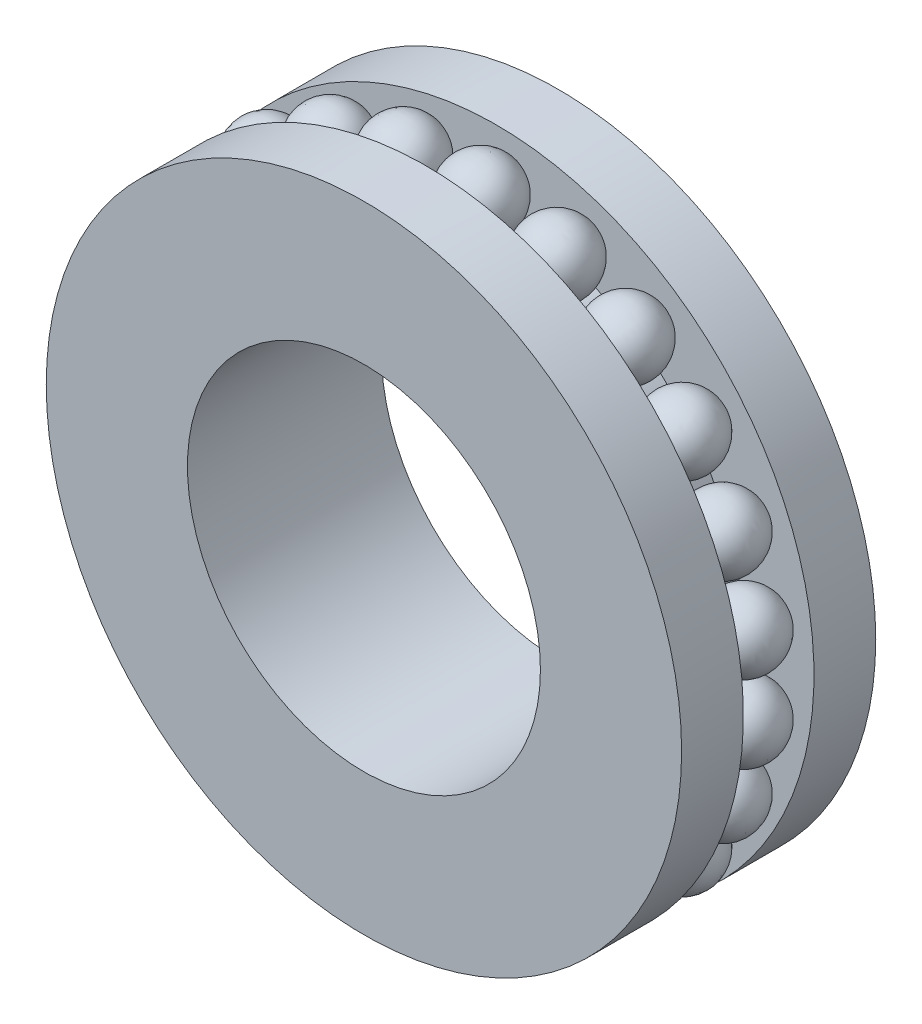
ISO-10303-21;
HEADER;
FILE_DESCRIPTION(('STEP AP214'),'2;1');
FILE_NAME('part.step','',(''),(''),'','','');
FILE_SCHEMA(('AUTOMOTIVE_DESIGN { 1 0 10303 214 1 1 1 1 }'));
ENDSEC;
DATA;
#1=APPLICATION_CONTEXT('core data for automotive mechanical design processes');
#2=APPLICATION_PROTOCOL_DEFINITION('international standard','automotive_design',2000,#1);
#3=PRODUCT_CONTEXT('',#1,'mechanical');
#4=PRODUCT('Part','Part','',(#3));
#5=PRODUCT_RELATED_PRODUCT_CATEGORY('part','',(#4));
#6=PRODUCT_DEFINITION_FORMATION('','',#4);
#7=PRODUCT_DEFINITION_CONTEXT('part definition',#1,'design');
#8=PRODUCT_DEFINITION('design','',#6,#7);
#9=PRODUCT_DEFINITION_SHAPE('','',#8);
#10=(LENGTH_UNIT() NAMED_UNIT(*) SI_UNIT(.MILLI.,.METRE.));
#11=(NAMED_UNIT(*) PLANE_ANGLE_UNIT() SI_UNIT($,.RADIAN.));
#12=(NAMED_UNIT(*) SI_UNIT($,.STERADIAN.) SOLID_ANGLE_UNIT());
#13=UNCERTAINTY_MEASURE_WITH_UNIT(LENGTH_MEASURE(1.E-05),#10,'distance_accuracy_value','');
#14=(GEOMETRIC_REPRESENTATION_CONTEXT(3) GLOBAL_UNCERTAINTY_ASSIGNED_CONTEXT((#13)) GLOBAL_UNIT_ASSIGNED_CONTEXT((#10,
#11,#12)) REPRESENTATION_CONTEXT('',''));
#15=CARTESIAN_POINT('',(0.,0.,0.));
#16=DIRECTION('',(0.,0.,1.));
#17=DIRECTION('',(1.,0.,0.));
#18=AXIS2_PLACEMENT_3D('',#15,#16,#17);
#19=CARTESIAN_POINT('',(-7.77421702330407,-2.1782334565188,2.75));
#20=DIRECTION('',(0.,0.,1.));
#21=DIRECTION('',(-0.962917287347803,-0.269796771157012,0.));
#22=AXIS2_PLACEMENT_3D('',#19,#20,#21);
#23=SPHERICAL_SURFACE('',#22,1.);
#24=CARTESIAN_POINT('',(-7.77421702330407,-2.1782334565188,3.75));
#25=VERTEX_POINT('',#24);
#26=VERTEX_LOOP('',#25);
#27=FACE_BOUND('',#26,.T.);
#28=ADVANCED_FACE('F42',(#27),#23,.T.);
#29=CLOSED_SHELL('',(#28));
#30=MANIFOLD_SOLID_BREP('B2',#29);
#31=CARTESIAN_POINT('',(-6.89824761393806,-4.19491730232272,2.75));
#32=DIRECTION('',(0.,0.,1.));
#33=DIRECTION('',(-0.854419404546495,-0.519583950035423,0.));
#34=AXIS2_PLACEMENT_3D('',#31,#32,#33);
#35=SPHERICAL_SURFACE('',#34,1.);
#36=CARTESIAN_POINT('',(-6.89824761393806,-4.19491730232272,3.75));
#37=VERTEX_POINT('',#36);
#38=VERTEX_LOOP('',#37);
#39=FACE_BOUND('',#38,.T.);
#40=ADVANCED_FACE('F61',(#39),#35,.T.);
#41=CLOSED_SHELL('',(#40));
#42=MANIFOLD_SOLID_BREP('B6',#41);
#43=CARTESIAN_POINT('',(-5.51066673642925,-5.90048332228308,2.75));
#44=DIRECTION('',(0.,0.,1.));
#45=DIRECTION('',(-0.682553143218663,-0.730835964278116,0.));
#46=AXIS2_PLACEMENT_3D('',#43,#44,#45);
#47=SPHERICAL_SURFACE('',#46,1.);
#48=CARTESIAN_POINT('',(-5.51066673642925,-5.90048332228308,3.75));
#49=VERTEX_POINT('',#48);
#50=VERTEX_LOOP('',#49);
#51=FACE_BOUND('',#50,.T.);
#52=ADVANCED_FACE('F80',(#51),#47,.T.);
#53=CLOSED_SHELL('',(#52));
#54=MANIFOLD_SOLID_BREP('B38',#53);
#55=CARTESIAN_POINT('',(-3.71438491670236,-7.16843748714479,2.75));
#56=DIRECTION('',(0.,0.,1.));
#57=DIRECTION('',(-0.460065037731162,-0.88788521840237,0.));
#58=AXIS2_PLACEMENT_3D('',#55,#56,#57);
#59=SPHERICAL_SURFACE('',#58,1.);
#60=CARTESIAN_POINT('',(-3.71438491670236,-7.16843748714479,3.75));
#61=VERTEX_POINT('',#60);
#62=VERTEX_LOOP('',#61);
#63=FACE_BOUND('',#62,.T.);
#64=ADVANCED_FACE('F99',(#63),#59,.T.);
#65=CLOSED_SHELL('',(#64));
#66=MANIFOLD_SOLID_BREP('B57',#65);
#67=CARTESIAN_POINT('',(-1.64262415988398,-7.90474143700438,2.75));
#68=DIRECTION('',(0.,0.,1.));
#69=DIRECTION('',(-0.203456013052645,-0.979084087682321,0.));
#70=AXIS2_PLACEMENT_3D('',#67,#68,#69);
#71=SPHERICAL_SURFACE('',#70,1.);
#72=CARTESIAN_POINT('',(-1.64262415988398,-7.90474143700438,3.75));
#73=VERTEX_POINT('',#72);
#74=VERTEX_LOOP('',#73);
#75=FACE_BOUND('',#74,.T.);
#76=ADVANCED_FACE('F118',(#75),#71,.T.);
#77=CLOSED_SHELL('',(#76));
#78=MANIFOLD_SOLID_BREP('B76',#77);
#79=CARTESIAN_POINT('',(0.550962516367486,-8.05478687626722,2.75));
#80=DIRECTION('',(0.,0.,1.));
#81=DIRECTION('',(0.0682424133646607,-0.99766876919054,0.));
#82=AXIS2_PLACEMENT_3D('',#79,#80,#81);
#83=SPHERICAL_SURFACE('',#82,1.);
#84=CARTESIAN_POINT('',(0.550962516367486,-8.05478687626722,3.75));
#85=VERTEX_POINT('',#84);
#86=VERTEX_LOOP('',#85);
#87=FACE_BOUND('',#86,.T.);
#88=ADVANCED_FACE('F137',(#87),#83,.T.);
#89=CLOSED_SHELL('',(#88));
#90=MANIFOLD_SOLID_BREP('B95',#89);
#91=CARTESIAN_POINT('',(2.70368682326577,-7.60744562111539,2.75));
#92=DIRECTION('',(0.,0.,1.));
#93=DIRECTION('',(0.334879612170977,-0.942260922118824,0.));
#94=AXIS2_PLACEMENT_3D('',#91,#92,#93);
#95=SPHERICAL_SURFACE('',#94,1.);
#96=CARTESIAN_POINT('',(2.70368682326577,-7.60744562111539,3.75));
#97=VERTEX_POINT('',#96);
#98=VERTEX_LOOP('',#97);
#99=FACE_BOUND('',#98,.T.);
#100=ADVANCED_FACE('F156',(#99),#95,.T.);
#101=CLOSED_SHELL('',(#100));
#102=MANIFOLD_SOLID_BREP('B114',#101);
#103=CARTESIAN_POINT('',(4.65589104702665,-6.59589492599342,2.75));
#104=DIRECTION('',(0.,0.,1.));
#105=DIRECTION('',(0.57668032211486,-0.816969893010447,0.));
#106=AXIS2_PLACEMENT_3D('',#103,#104,#105);
#107=SPHERICAL_SURFACE('',#106,1.);
#108=CARTESIAN_POINT('',(4.65589104702665,-6.59589492599342,3.75));
#109=VERTEX_POINT('',#108);
#110=VERTEX_LOOP('',#109);
#111=FACE_BOUND('',#110,.T.);
#112=ADVANCED_FACE('F175',(#111),#107,.T.);
#113=CLOSED_SHELL('',(#112));
#114=MANIFOLD_SOLID_BREP('B133',#113);
#115=CARTESIAN_POINT('',(6.26278913111383,-5.09515687842201,2.75));
#116=DIRECTION('',(0.,0.,1.));
#117=DIRECTION('',(0.775711290704414,-0.631087944326059,0.));
#118=AXIS2_PLACEMENT_3D('',#115,#116,#117);
#119=SPHERICAL_SURFACE('',#118,1.);
#120=CARTESIAN_POINT('',(6.26278913111383,-5.09515687842201,3.75));
#121=VERTEX_POINT('',#120);
#122=VERTEX_LOOP('',#121);
#123=FACE_BOUND('',#122,.T.);
#124=ADVANCED_FACE('F194',(#123),#119,.T.);
#125=CLOSED_SHELL('',(#124));
#126=MANIFOLD_SOLID_BREP('B152',#125);
#127=CARTESIAN_POINT('',(7.40520479570018,-3.21653435396978,2.75));
#128=DIRECTION('',(0.,0.,1.));
#129=DIRECTION('',(0.91721130150545,-0.398401089846249,0.));
#130=AXIS2_PLACEMENT_3D('',#127,#128,#129);
#131=SPHERICAL_SURFACE('',#130,1.);
#132=CARTESIAN_POINT('',(7.40520479570018,-3.21653435396978,3.75));
#133=VERTEX_POINT('',#132);
#134=VERTEX_LOOP('',#133);
#135=FACE_BOUND('',#134,.T.);
#136=ADVANCED_FACE('F213',(#135),#131,.T.);
#137=CLOSED_SHELL('',(#136));
#138=MANIFOLD_SOLID_BREP('B171',#137);
#139=CARTESIAN_POINT('',(7.99841029714722,-1.09935619114917,2.75));
#140=DIRECTION('',(0.,0.,1.));
#141=DIRECTION('',(0.99068594603633,-0.136166649096254,0.));
#142=AXIS2_PLACEMENT_3D('',#139,#140,#141);
#143=SPHERICAL_SURFACE('',#142,1.);
#144=CARTESIAN_POINT('',(7.99841029714722,-1.09935619114917,3.75));
#145=VERTEX_POINT('',#144);
#146=VERTEX_LOOP('',#145);
#147=FACE_BOUND('',#146,.T.);
#148=ADVANCED_FACE('F232',(#147),#143,.T.);
#149=CLOSED_SHELL('',(#148));
#150=MANIFOLD_SOLID_BREP('B190',#149);
#151=CARTESIAN_POINT('',(7.99841029714723,1.09935619114906,2.75));
#152=DIRECTION('',(0.,0.,1.));
#153=DIRECTION('',(0.990685946036332,0.13616664909624,0.));
#154=AXIS2_PLACEMENT_3D('',#151,#152,#153);
#155=SPHERICAL_SURFACE('',#154,1.);
#156=CARTESIAN_POINT('',(7.99841029714723,1.09935619114906,3.75));
#157=VERTEX_POINT('',#156);
#158=VERTEX_LOOP('',#157);
#159=FACE_BOUND('',#158,.T.);
#160=ADVANCED_FACE('F251',(#159),#155,.T.);
#161=CLOSED_SHELL('',(#160));
#162=MANIFOLD_SOLID_BREP('B209',#161);
#163=CARTESIAN_POINT('',(7.40520479570022,3.21653435396968,2.75));
#164=DIRECTION('',(0.,0.,1.));
#165=DIRECTION('',(0.917211301505455,0.398401089846236,0.));
#166=AXIS2_PLACEMENT_3D('',#163,#164,#165);
#167=SPHERICAL_SURFACE('',#166,1.);
#168=CARTESIAN_POINT('',(7.40520479570022,3.21653435396968,3.75));
#169=VERTEX_POINT('',#168);
#170=VERTEX_LOOP('',#169);
#171=FACE_BOUND('',#170,.T.);
#172=ADVANCED_FACE('F270',(#171),#167,.T.);
#173=CLOSED_SHELL('',(#172));
#174=MANIFOLD_SOLID_BREP('B228',#173);
#175=CARTESIAN_POINT('',(6.2627891311139,5.09515687842192,2.75));
#176=DIRECTION('',(0.,0.,1.));
#177=DIRECTION('',(0.775711290704423,0.631087944326049,0.));
#178=AXIS2_PLACEMENT_3D('',#175,#176,#177);
#179=SPHERICAL_SURFACE('',#178,1.);
#180=CARTESIAN_POINT('',(6.2627891311139,5.09515687842192,3.75));
#181=VERTEX_POINT('',#180);
#182=VERTEX_LOOP('',#181);
#183=FACE_BOUND('',#182,.T.);
#184=ADVANCED_FACE('F289',(#183),#179,.T.);
#185=CLOSED_SHELL('',(#184));
#186=MANIFOLD_SOLID_BREP('B247',#185);
#187=CARTESIAN_POINT('',(4.65589104702674,6.59589492599336,2.75));
#188=DIRECTION('',(0.,0.,1.));
#189=DIRECTION('',(0.576680322114871,0.816969893010439,0.));
#190=AXIS2_PLACEMENT_3D('',#187,#188,#189);
#191=SPHERICAL_SURFACE('',#190,1.);
#192=CARTESIAN_POINT('',(4.65589104702674,6.59589492599336,3.75));
#193=VERTEX_POINT('',#192);
#194=VERTEX_LOOP('',#193);
#195=FACE_BOUND('',#194,.T.);
#196=ADVANCED_FACE('F308',(#195),#191,.T.);
#197=CLOSED_SHELL('',(#196));
#198=MANIFOLD_SOLID_BREP('B266',#197);
#199=CARTESIAN_POINT('',(2.70368682326588,7.60744562111535,2.75));
#200=DIRECTION('',(0.,0.,1.));
#201=DIRECTION('',(0.33487961217099,0.942260922118819,0.));
#202=AXIS2_PLACEMENT_3D('',#199,#200,#201);
#203=SPHERICAL_SURFACE('',#202,1.);
#204=CARTESIAN_POINT('',(2.70368682326588,7.60744562111535,3.75));
#205=VERTEX_POINT('',#204);
#206=VERTEX_LOOP('',#205);
#207=FACE_BOUND('',#206,.T.);
#208=ADVANCED_FACE('F327',(#207),#203,.T.);
#209=CLOSED_SHELL('',(#208));
#210=MANIFOLD_SOLID_BREP('B285',#209);
#211=CARTESIAN_POINT('',(0.550962516367598,8.05478687626722,2.75));
#212=DIRECTION('',(0.,0.,1.));
#213=DIRECTION('',(0.0682424133646747,0.997668769190539,0.));
#214=AXIS2_PLACEMENT_3D('',#211,#212,#213);
#215=SPHERICAL_SURFACE('',#214,1.);
#216=CARTESIAN_POINT('',(0.550962516367598,8.05478687626722,3.75));
#217=VERTEX_POINT('',#216);
#218=VERTEX_LOOP('',#217);
#219=FACE_BOUND('',#218,.T.);
#220=ADVANCED_FACE('F346',(#219),#215,.T.);
#221=CLOSED_SHELL('',(#220));
#222=MANIFOLD_SOLID_BREP('B304',#221);
#223=CARTESIAN_POINT('',(-1.64262415988387,7.90474143700441,2.75));
#224=DIRECTION('',(0.,0.,1.));
#225=DIRECTION('',(-0.203456013052631,0.979084087682323,0.));
#226=AXIS2_PLACEMENT_3D('',#223,#224,#225);
#227=SPHERICAL_SURFACE('',#226,1.);
#228=CARTESIAN_POINT('',(-1.64262415988387,7.90474143700441,3.75));
#229=VERTEX_POINT('',#228);
#230=VERTEX_LOOP('',#229);
#231=FACE_BOUND('',#230,.T.);
#232=ADVANCED_FACE('F365',(#231),#227,.T.);
#233=CLOSED_SHELL('',(#232));
#234=MANIFOLD_SOLID_BREP('B323',#233);
#235=CARTESIAN_POINT('',(-3.71438491670226,7.16843748714484,2.75));
#236=DIRECTION('',(0.,0.,1.));
#237=DIRECTION('',(-0.46006503773115,0.887885218402376,0.));
#238=AXIS2_PLACEMENT_3D('',#235,#236,#237);
#239=SPHERICAL_SURFACE('',#238,1.);
#240=CARTESIAN_POINT('',(-3.71438491670226,7.16843748714484,3.75));
#241=VERTEX_POINT('',#240);
#242=VERTEX_LOOP('',#241);
#243=FACE_BOUND('',#242,.T.);
#244=ADVANCED_FACE('F384',(#243),#239,.T.);
#245=CLOSED_SHELL('',(#244));
#246=MANIFOLD_SOLID_BREP('B342',#245);
#247=CARTESIAN_POINT('',(-5.51066673642918,5.90048332228316,2.75));
#248=DIRECTION('',(0.,0.,1.));
#249=DIRECTION('',(-0.682553143218653,0.730835964278125,0.));
#250=AXIS2_PLACEMENT_3D('',#247,#248,#249);
#251=SPHERICAL_SURFACE('',#250,1.);
#252=CARTESIAN_POINT('',(-5.51066673642918,5.90048332228316,3.75));
#253=VERTEX_POINT('',#252);
#254=VERTEX_LOOP('',#253);
#255=FACE_BOUND('',#254,.T.);
#256=ADVANCED_FACE('F403',(#255),#251,.T.);
#257=CLOSED_SHELL('',(#256));
#258=MANIFOLD_SOLID_BREP('B361',#257);
#259=CARTESIAN_POINT('',(-6.898247613938,4.19491730232282,2.75));
#260=DIRECTION('',(0.,0.,1.));
#261=DIRECTION('',(-0.854419404546488,0.519583950035435,0.));
#262=AXIS2_PLACEMENT_3D('',#259,#260,#261);
#263=SPHERICAL_SURFACE('',#262,1.);
#264=CARTESIAN_POINT('',(-6.898247613938,4.19491730232282,3.75));
#265=VERTEX_POINT('',#264);
#266=VERTEX_LOOP('',#265);
#267=FACE_BOUND('',#266,.T.);
#268=ADVANCED_FACE('F422',(#267),#263,.T.);
#269=CLOSED_SHELL('',(#268));
#270=MANIFOLD_SOLID_BREP('B380',#269);
#271=CARTESIAN_POINT('',(-7.77421702330404,2.17823345651891,2.75));
#272=DIRECTION('',(0.,0.,1.));
#273=DIRECTION('',(-0.962917287347799,0.269796771157025,0.));
#274=AXIS2_PLACEMENT_3D('',#271,#272,#273);
#275=SPHERICAL_SURFACE('',#274,1.);
#276=CARTESIAN_POINT('',(-7.77421702330404,2.17823345651891,3.75));
#277=VERTEX_POINT('',#276);
#278=VERTEX_LOOP('',#277);
#279=FACE_BOUND('',#278,.T.);
#280=ADVANCED_FACE('F441',(#279),#275,.T.);
#281=CLOSED_SHELL('',(#280));
#282=MANIFOLD_SOLID_BREP('B399',#281);
#283=CARTESIAN_POINT('',(-8.07360832072802,0.,2.75));
#284=DIRECTION('',(0.,0.,1.));
#285=DIRECTION('',(-1.,0.,0.));
#286=AXIS2_PLACEMENT_3D('',#283,#284,#285);
#287=SPHERICAL_SURFACE('',#286,1.);
#288=CARTESIAN_POINT('',(-8.07360832072802,0.,3.75));
#289=VERTEX_POINT('',#288);
#290=VERTEX_LOOP('',#289);
#291=FACE_BOUND('',#290,.T.);
#292=ADVANCED_FACE('F463',(#291),#287,.T.);
#293=CLOSED_SHELL('',(#292));
#294=MANIFOLD_SOLID_BREP('B418',#293);
#295=CARTESIAN_POINT('',(0.,0.,5.5));
#296=DIRECTION('',(0.,0.,-1.));
#297=DIRECTION('',(-1.,0.,0.));
#298=AXIS2_PLACEMENT_3D('',#295,#296,#297);
#299=CYLINDRICAL_SURFACE('',#298,9.);
#300=CARTESIAN_POINT('',(0.,0.,5.5));
#301=DIRECTION('',(0.,0.,1.));
#302=DIRECTION('',(1.,0.,0.));
#303=AXIS2_PLACEMENT_3D('',#300,#301,#302);
#304=CIRCLE('',#303,9.);
#305=CARTESIAN_POINT('',(9.,0.,5.5));
#306=VERTEX_POINT('',#305);
#307=EDGE_CURVE('E461',#306,#306,#304,.T.);
#308=ORIENTED_EDGE('',*,*,#307,.F.);
#309=EDGE_LOOP('',(#308));
#310=FACE_BOUND('',#309,.T.);
#311=CARTESIAN_POINT('',(0.,0.,3.75));
#312=DIRECTION('',(0.,0.,-1.));
#313=DIRECTION('',(-1.,0.,0.));
#314=AXIS2_PLACEMENT_3D('',#311,#312,#313);
#315=CIRCLE('',#314,9.);
#316=CARTESIAN_POINT('',(-9.,0.,3.75));
#317=VERTEX_POINT('',#316);
#318=EDGE_CURVE('E502',#317,#317,#315,.T.);
#319=ORIENTED_EDGE('',*,*,#318,.F.);
#320=EDGE_LOOP('',(#319));
#321=FACE_BOUND('',#320,.T.);
#322=ADVANCED_FACE('F476',(#310,#321),#299,.T.);
#323=CARTESIAN_POINT('',(0.,0.,5.5));
#324=DIRECTION('',(0.,0.,1.));
#325=DIRECTION('',(1.,0.,0.));
#326=AXIS2_PLACEMENT_3D('',#323,#324,#325);
#327=PLANE('',#326);
#328=ORIENTED_EDGE('',*,*,#307,.T.);
#329=EDGE_LOOP('',(#328));
#330=FACE_BOUND('',#329,.T.);
#331=CARTESIAN_POINT('',(0.,0.,5.5));
#332=DIRECTION('',(0.,0.,1.));
#333=DIRECTION('',(1.,0.,0.));
#334=AXIS2_PLACEMENT_3D('',#331,#332,#333);
#335=CIRCLE('',#334,5.);
#336=CARTESIAN_POINT('',(5.,0.,5.5));
#337=VERTEX_POINT('',#336);
#338=EDGE_CURVE('E518',#337,#337,#335,.T.);
#339=ORIENTED_EDGE('',*,*,#338,.F.);
#340=EDGE_LOOP('',(#339));
#341=FACE_BOUND('',#340,.T.);
#342=ADVANCED_FACE('F541',(#330,#341),#327,.T.);
#343=CARTESIAN_POINT('',(0.,0.,0.));
#344=DIRECTION('',(0.,0.,1.));
#345=DIRECTION('',(1.,0.,0.));
#346=AXIS2_PLACEMENT_3D('',#343,#344,#345);
#347=PLANE('',#346);
#348=CARTESIAN_POINT('',(0.,0.,0.));
#349=DIRECTION('',(0.,0.,1.));
#350=DIRECTION('',(1.,0.,0.));
#351=AXIS2_PLACEMENT_3D('',#348,#349,#350);
#352=CIRCLE('',#351,9.);
#353=CARTESIAN_POINT('',(9.,0.,0.));
#354=VERTEX_POINT('',#353);
#355=EDGE_CURVE('E480',#354,#354,#352,.T.);
#356=ORIENTED_EDGE('',*,*,#355,.F.);
#357=EDGE_LOOP('',(#356));
#358=FACE_BOUND('',#357,.T.);
#359=CARTESIAN_POINT('',(0.,0.,0.));
#360=DIRECTION('',(0.,0.,1.));
#361=DIRECTION('',(1.,0.,0.));
#362=AXIS2_PLACEMENT_3D('',#359,#360,#361);
#363=CIRCLE('',#362,5.);
#364=CARTESIAN_POINT('',(5.,0.,0.));
#365=VERTEX_POINT('',#364);
#366=EDGE_CURVE('E517',#365,#365,#363,.T.);
#367=ORIENTED_EDGE('',*,*,#366,.T.);
#368=EDGE_LOOP('',(#367));
#369=FACE_BOUND('',#368,.T.);
#370=ADVANCED_FACE('F526',(#358,#369),#347,.F.);
#371=CARTESIAN_POINT('',(0.,0.,1.75));
#372=DIRECTION('',(0.,0.,-1.));
#373=DIRECTION('',(-1.,0.,0.));
#374=AXIS2_PLACEMENT_3D('',#371,#372,#373);
#375=CIRCLE('',#374,9.);
#376=CARTESIAN_POINT('',(-9.,0.,1.75));
#377=VERTEX_POINT('',#376);
#378=EDGE_CURVE('E510',#377,#377,#375,.T.);
#379=ORIENTED_EDGE('',*,*,#378,.T.);
#380=EDGE_LOOP('',(#379));
#381=FACE_BOUND('',#380,.T.);
#382=ORIENTED_EDGE('',*,*,#355,.T.);
#383=EDGE_LOOP('',(#382));
#384=FACE_BOUND('',#383,.T.);
#385=ADVANCED_FACE('F478',(#381,#384),#299,.T.);
#386=CARTESIAN_POINT('',(0.,0.,5.5));
#387=DIRECTION('',(0.,0.,-1.));
#388=DIRECTION('',(-1.,0.,0.));
#389=AXIS2_PLACEMENT_3D('',#386,#387,#388);
#390=CYLINDRICAL_SURFACE('',#389,5.);
#391=ORIENTED_EDGE('',*,*,#338,.T.);
#392=EDGE_LOOP('',(#391));
#393=FACE_BOUND('',#392,.T.);
#394=ORIENTED_EDGE('',*,*,#366,.F.);
#395=EDGE_LOOP('',(#394));
#396=FACE_BOUND('',#395,.T.);
#397=ADVANCED_FACE('F528',(#393,#396),#390,.F.);
#398=CARTESIAN_POINT('',(0.,0.,1.75));
#399=DIRECTION('',(0.,0.,-1.));
#400=DIRECTION('',(-1.,0.,0.));
#401=AXIS2_PLACEMENT_3D('',#398,#399,#400);
#402=PLANE('',#401);
#403=CARTESIAN_POINT('',(-8.07360832072802,0.,1.75));
#404=VERTEX_POINT('',#403);
#405=VERTEX_LOOP('',#404);
#406=FACE_BOUND('',#405,.T.);
#407=ORIENTED_EDGE('',*,*,#378,.F.);
#408=EDGE_LOOP('',(#407));
#409=FACE_BOUND('',#408,.T.);
#410=CARTESIAN_POINT('',(0.,0.,1.75));
#411=DIRECTION('',(0.,0.,-1.));
#412=DIRECTION('',(-1.,0.,0.));
#413=AXIS2_PLACEMENT_3D('',#410,#411,#412);
#414=CIRCLE('',#413,7.);
#415=CARTESIAN_POINT('',(-7.,0.,1.75));
#416=VERTEX_POINT('',#415);
#417=EDGE_CURVE('E505',#416,#416,#414,.T.);
#418=ORIENTED_EDGE('',*,*,#417,.T.);
#419=EDGE_LOOP('',(#418));
#420=FACE_BOUND('',#419,.T.);
#421=ADVANCED_FACE('F530',(#406,#409,#420),#402,.F.);
#422=CARTESIAN_POINT('',(0.,0.,1.75));
#423=DIRECTION('',(0.,0.,1.));
#424=DIRECTION('',(1.,0.,0.));
#425=AXIS2_PLACEMENT_3D('',#422,#423,#424);
#426=CYLINDRICAL_SURFACE('',#425,7.);
#427=ORIENTED_EDGE('',*,*,#417,.F.);
#428=EDGE_LOOP('',(#427));
#429=FACE_BOUND('',#428,.T.);
#430=CARTESIAN_POINT('',(0.,0.,3.75));
#431=DIRECTION('',(0.,0.,-1.));
#432=DIRECTION('',(-1.,0.,0.));
#433=AXIS2_PLACEMENT_3D('',#430,#431,#432);
#434=CIRCLE('',#433,7.);
#435=CARTESIAN_POINT('',(-7.,0.,3.75));
#436=VERTEX_POINT('',#435);
#437=EDGE_CURVE('E499',#436,#436,#434,.T.);
#438=ORIENTED_EDGE('',*,*,#437,.T.);
#439=EDGE_LOOP('',(#438));
#440=FACE_BOUND('',#439,.T.);
#441=ADVANCED_FACE('F494',(#429,#440),#426,.T.);
#442=CARTESIAN_POINT('',(0.,0.,3.75));
#443=DIRECTION('',(0.,0.,-1.));
#444=DIRECTION('',(-1.,0.,0.));
#445=AXIS2_PLACEMENT_3D('',#442,#443,#444);
#446=PLANE('',#445);
#447=CARTESIAN_POINT('',(-8.07360832072802,0.,3.75));
#448=VERTEX_POINT('',#447);
#449=VERTEX_LOOP('',#448);
#450=FACE_BOUND('',#449,.T.);
#451=ORIENTED_EDGE('',*,*,#437,.F.);
#452=EDGE_LOOP('',(#451));
#453=FACE_BOUND('',#452,.T.);
#454=ORIENTED_EDGE('',*,*,#318,.T.);
#455=EDGE_LOOP('',(#454));
#456=FACE_BOUND('',#455,.T.);
#457=ADVANCED_FACE('F491',(#450,#453,#456),#446,.T.);
#458=CLOSED_SHELL('',(#322,#342,#370,#385,#397,#421,#441,#457));
#459=MANIFOLD_SOLID_BREP('B437',#458);
#460=ADVANCED_BREP_SHAPE_REPRESENTATION('',(#18,#30,#42,#54,#66,#78,#90,#102,#114,#126,#138,
#150,#162,#174,#186,#198,#210,#222,#234,#246,#258,#270,#282,#294,#459),#14);
#461=SHAPE_DEFINITION_REPRESENTATION(#9,#460);
ENDSEC;
END-ISO-10303-21;
